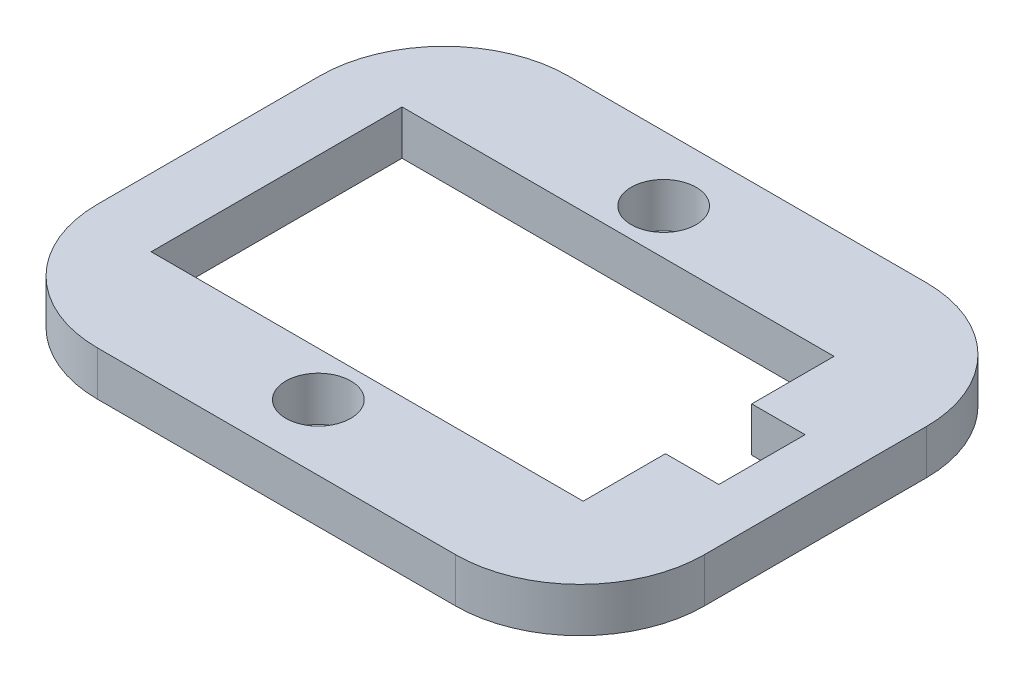
ISO-10303-21;
HEADER;
FILE_DESCRIPTION(('STEP AP214'),'2;1');
FILE_NAME('part.step','',(''),(''),'','','');
FILE_SCHEMA(('AUTOMOTIVE_DESIGN { 1 0 10303 214 1 1 1 1 }'));
ENDSEC;
DATA;
#1=APPLICATION_CONTEXT('core data for automotive mechanical design processes');
#2=APPLICATION_PROTOCOL_DEFINITION('international standard','automotive_design',2000,#1);
#3=PRODUCT_CONTEXT('',#1,'mechanical');
#4=PRODUCT('Part','Part','',(#3));
#5=PRODUCT_RELATED_PRODUCT_CATEGORY('part','',(#4));
#6=PRODUCT_DEFINITION_FORMATION('','',#4);
#7=PRODUCT_DEFINITION_CONTEXT('part definition',#1,'design');
#8=PRODUCT_DEFINITION('design','',#6,#7);
#9=PRODUCT_DEFINITION_SHAPE('','',#8);
#10=(LENGTH_UNIT() NAMED_UNIT(*) SI_UNIT(.MILLI.,.METRE.));
#11=(NAMED_UNIT(*) PLANE_ANGLE_UNIT() SI_UNIT($,.RADIAN.));
#12=(NAMED_UNIT(*) SI_UNIT($,.STERADIAN.) SOLID_ANGLE_UNIT());
#13=UNCERTAINTY_MEASURE_WITH_UNIT(LENGTH_MEASURE(1.E-05),#10,'distance_accuracy_value','');
#14=(GEOMETRIC_REPRESENTATION_CONTEXT(3) GLOBAL_UNCERTAINTY_ASSIGNED_CONTEXT((#13)) GLOBAL_UNIT_ASSIGNED_CONTEXT((#10,
#11,#12)) REPRESENTATION_CONTEXT('',''));
#15=CARTESIAN_POINT('',(0.,0.,0.));
#16=DIRECTION('',(0.,0.,1.));
#17=DIRECTION('',(1.,0.,0.));
#18=AXIS2_PLACEMENT_3D('',#15,#16,#17);
#19=CARTESIAN_POINT('',(-9.70149163847779,1.25,5.46157378435517));
#20=DIRECTION('',(0.,1.,0.));
#21=DIRECTION('',(0.,0.,1.));
#22=AXIS2_PLACEMENT_3D('',#19,#20,#21);
#23=PLANE('',#22);
#24=CARTESIAN_POINT('',(-0.702610465116271,1.25,-10.3664818651471));
#25=DIRECTION('',(0.,1.,0.));
#26=DIRECTION('',(0.,0.,1.));
#27=AXIS2_PLACEMENT_3D('',#24,#25,#26);
#28=CIRCLE('',#27,1.825);
#29=CARTESIAN_POINT('',(-0.702610465116271,1.25,-8.54148186514709));
#30=VERTEX_POINT('',#29);
#31=EDGE_CURVE('E201',#30,#30,#28,.T.);
#32=ORIENTED_EDGE('',*,*,#31,.F.);
#33=EDGE_LOOP('',(#32));
#34=FACE_BOUND('',#33,.T.);
#35=CARTESIAN_POINT('',(-9.70149163847779,1.25,5.46157378435517));
#36=DIRECTION('',(0.,1.,0.));
#37=DIRECTION('',(0.,0.,1.));
#38=AXIS2_PLACEMENT_3D('',#35,#36,#37);
#39=CIRCLE('',#38,7.);
#40=CARTESIAN_POINT('',(-16.7014916384778,1.25,5.46157378435512));
#41=VERTEX_POINT('',#40);
#42=CARTESIAN_POINT('',(-9.70149163847774,1.25,12.4615737843552));
#43=VERTEX_POINT('',#42);
#44=EDGE_CURVE('E245',#41,#43,#39,.T.);
#45=ORIENTED_EDGE('',*,*,#44,.T.);
#46=DIRECTION('',(1.,0.,0.));
#47=VECTOR('',#46,1.);
#48=CARTESIAN_POINT('',(-9.70149163847774,1.25,12.4615737843552));
#49=LINE('',#48,#47);
#50=CARTESIAN_POINT('',(10.4229383615221,1.25,12.4615737843552));
#51=VERTEX_POINT('',#50);
#52=EDGE_CURVE('E249',#43,#51,#49,.T.);
#53=ORIENTED_EDGE('',*,*,#52,.T.);
#54=CARTESIAN_POINT('',(10.4229383615222,1.25,5.46157378435517));
#55=DIRECTION('',(0.,1.,0.));
#56=DIRECTION('',(0.,0.,1.));
#57=AXIS2_PLACEMENT_3D('',#54,#55,#56);
#58=CIRCLE('',#57,7.);
#59=CARTESIAN_POINT('',(17.4229383615222,1.25,5.46157378435512));
#60=VERTEX_POINT('',#59);
#61=EDGE_CURVE('E253',#51,#60,#58,.T.);
#62=ORIENTED_EDGE('',*,*,#61,.T.);
#63=DIRECTION('',(0.,0.,-1.));
#64=VECTOR('',#63,1.);
#65=CARTESIAN_POINT('',(17.4229383615222,1.25,-7.01657898520079));
#66=LINE('',#65,#64);
#67=CARTESIAN_POINT('',(17.4229383615222,1.25,-7.01657898520079));
#68=VERTEX_POINT('',#67);
#69=EDGE_CURVE('E256',#60,#68,#66,.T.);
#70=ORIENTED_EDGE('',*,*,#69,.T.);
#71=CARTESIAN_POINT('',(10.4229383615222,1.25,-7.01657898520084));
#72=DIRECTION('',(0.,1.,0.));
#73=DIRECTION('',(0.,0.,-1.));
#74=AXIS2_PLACEMENT_3D('',#71,#72,#73);
#75=CIRCLE('',#74,7.);
#76=CARTESIAN_POINT('',(10.4229383615221,1.25,-14.0165789852008));
#77=VERTEX_POINT('',#76);
#78=EDGE_CURVE('E259',#68,#77,#75,.T.);
#79=ORIENTED_EDGE('',*,*,#78,.T.);
#80=DIRECTION('',(-1.,0.,0.));
#81=VECTOR('',#80,1.);
#82=CARTESIAN_POINT('',(-9.70149163847775,1.25,-14.0165789852008));
#83=LINE('',#82,#81);
#84=CARTESIAN_POINT('',(-9.70149163847775,1.25,-14.0165789852008));
#85=VERTEX_POINT('',#84);
#86=EDGE_CURVE('E262',#77,#85,#83,.T.);
#87=ORIENTED_EDGE('',*,*,#86,.T.);
#88=CARTESIAN_POINT('',(-9.7014916384778,1.25,-7.01657898520084));
#89=DIRECTION('',(0.,1.,0.));
#90=DIRECTION('',(0.,0.,1.));
#91=AXIS2_PLACEMENT_3D('',#88,#89,#90);
#92=CIRCLE('',#91,7.);
#93=CARTESIAN_POINT('',(-16.7014916384778,1.25,-7.01657898520079));
#94=VERTEX_POINT('',#93);
#95=EDGE_CURVE('E265',#85,#94,#92,.T.);
#96=ORIENTED_EDGE('',*,*,#95,.T.);
#97=DIRECTION('',(0.,0.,1.));
#98=VECTOR('',#97,1.);
#99=CARTESIAN_POINT('',(-16.7014916384778,1.25,-7.01657898520079));
#100=LINE('',#99,#98);
#101=EDGE_CURVE('E268',#94,#41,#100,.T.);
#102=ORIENTED_EDGE('',*,*,#101,.T.);
#103=EDGE_LOOP('',(#45,#53,#62,#70,#79,#87,#96,#102));
#104=FACE_BOUND('',#103,.T.);
#105=DIRECTION('',(1.,0.,0.));
#106=VECTOR('',#105,1.);
#107=CARTESIAN_POINT('',(11.4112391266143,1.25,6.27157377957716));
#108=LINE('',#107,#106);
#109=CARTESIAN_POINT('',(-12.8783508733857,1.25,6.27157377957716));
#110=VERTEX_POINT('',#109);
#111=CARTESIAN_POINT('',(11.4112391266143,1.25,6.27157377957716));
#112=VERTEX_POINT('',#111);
#113=EDGE_CURVE('E162',#110,#112,#108,.T.);
#114=ORIENTED_EDGE('',*,*,#113,.F.);
#115=DIRECTION('',(0.,0.,1.));
#116=VECTOR('',#115,1.);
#117=CARTESIAN_POINT('',(-12.8783508733857,1.25,6.27157377957716));
#118=LINE('',#117,#116);
#119=CARTESIAN_POINT('',(-12.8783508733857,1.25,-7.83354898042284));
#120=VERTEX_POINT('',#119);
#121=EDGE_CURVE('E153',#120,#110,#118,.T.);
#122=ORIENTED_EDGE('',*,*,#121,.F.);
#123=DIRECTION('',(-1.,0.,0.));
#124=VECTOR('',#123,1.);
#125=CARTESIAN_POINT('',(-12.8783508733857,1.25,-7.83354898042284));
#126=LINE('',#125,#124);
#127=CARTESIAN_POINT('',(11.4112391266143,1.25,-7.83354898042284));
#128=VERTEX_POINT('',#127);
#129=EDGE_CURVE('E196',#128,#120,#126,.T.);
#130=ORIENTED_EDGE('',*,*,#129,.F.);
#131=DIRECTION('',(0.,0.,-1.));
#132=VECTOR('',#131,1.);
#133=CARTESIAN_POINT('',(11.4112391266143,1.25,-7.83354898042284));
#134=LINE('',#133,#132);
#135=CARTESIAN_POINT('',(11.4112391266143,1.25,-3.20588260042284));
#136=VERTEX_POINT('',#135);
#137=EDGE_CURVE('E193',#136,#128,#134,.T.);
#138=ORIENTED_EDGE('',*,*,#137,.F.);
#139=DIRECTION('',(-1.,0.,0.));
#140=VECTOR('',#139,1.);
#141=CARTESIAN_POINT('',(11.4112391266143,1.25,-3.20588260042284));
#142=LINE('',#141,#140);
#143=CARTESIAN_POINT('',(14.4112391266143,1.25,-3.20588260042284));
#144=VERTEX_POINT('',#143);
#145=EDGE_CURVE('E190',#144,#136,#142,.T.);
#146=ORIENTED_EDGE('',*,*,#145,.F.);
#147=DIRECTION('',(0.,0.,-1.));
#148=VECTOR('',#147,1.);
#149=CARTESIAN_POINT('',(14.4112391266143,1.25,-3.20588260042284));
#150=LINE('',#149,#148);
#151=CARTESIAN_POINT('',(14.4112391266143,1.25,1.64390739957716));
#152=VERTEX_POINT('',#151);
#153=EDGE_CURVE('E187',#152,#144,#150,.T.);
#154=ORIENTED_EDGE('',*,*,#153,.F.);
#155=DIRECTION('',(1.,0.,0.));
#156=VECTOR('',#155,1.);
#157=CARTESIAN_POINT('',(14.4112391266143,1.25,1.64390739957716));
#158=LINE('',#157,#156);
#159=CARTESIAN_POINT('',(11.4112391266143,1.25,1.64390739957716));
#160=VERTEX_POINT('',#159);
#161=EDGE_CURVE('E181',#160,#152,#158,.T.);
#162=ORIENTED_EDGE('',*,*,#161,.F.);
#163=DIRECTION('',(0.,0.,-1.));
#164=VECTOR('',#163,1.);
#165=CARTESIAN_POINT('',(11.4112391266143,1.25,1.64390739957716));
#166=LINE('',#165,#164);
#167=EDGE_CURVE('E177',#112,#160,#166,.T.);
#168=ORIENTED_EDGE('',*,*,#167,.F.);
#169=EDGE_LOOP('',(#114,#122,#130,#138,#146,#154,#162,#168));
#170=FACE_BOUND('',#169,.T.);
#171=CARTESIAN_POINT('',(-0.978049999999997,1.25,8.77351813485291));
#172=DIRECTION('',(0.,1.,0.));
#173=DIRECTION('',(0.,0.,1.));
#174=AXIS2_PLACEMENT_3D('',#171,#172,#173);
#175=CIRCLE('',#174,1.825);
#176=CARTESIAN_POINT('',(-0.978049999999997,1.25,10.5985181348529));
#177=VERTEX_POINT('',#176);
#178=EDGE_CURVE('E424',#177,#177,#175,.T.);
#179=ORIENTED_EDGE('',*,*,#178,.F.);
#180=EDGE_LOOP('',(#179));
#181=FACE_BOUND('',#180,.T.);
#182=ADVANCED_FACE('F39',(#34,#104,#170,#181),#23,.T.);
#183=CARTESIAN_POINT('',(-9.70149163847779,-1.25,5.46157378435517));
#184=DIRECTION('',(0.,1.,0.));
#185=DIRECTION('',(0.,0.,1.));
#186=AXIS2_PLACEMENT_3D('',#183,#184,#185);
#187=PLANE('',#186);
#188=CARTESIAN_POINT('',(-9.70149163847779,-1.25,5.46157378435517));
#189=DIRECTION('',(0.,1.,0.));
#190=DIRECTION('',(0.,0.,1.));
#191=AXIS2_PLACEMENT_3D('',#188,#189,#190);
#192=CIRCLE('',#191,7.);
#193=CARTESIAN_POINT('',(-16.7014916384778,-1.25,5.46157378435512));
#194=VERTEX_POINT('',#193);
#195=CARTESIAN_POINT('',(-9.70149163847774,-1.25,12.4615737843552));
#196=VERTEX_POINT('',#195);
#197=EDGE_CURVE('E171',#194,#196,#192,.T.);
#198=ORIENTED_EDGE('',*,*,#197,.F.);
#199=DIRECTION('',(0.,0.,1.));
#200=VECTOR('',#199,1.);
#201=CARTESIAN_POINT('',(-16.7014916384778,-1.25,-7.01657898520079));
#202=LINE('',#201,#200);
#203=CARTESIAN_POINT('',(-16.7014916384778,-1.25,-7.01657898520079));
#204=VERTEX_POINT('',#203);
#205=EDGE_CURVE('E250',#204,#194,#202,.T.);
#206=ORIENTED_EDGE('',*,*,#205,.F.);
#207=CARTESIAN_POINT('',(-9.7014916384778,-1.25,-7.01657898520084));
#208=DIRECTION('',(0.,1.,0.));
#209=DIRECTION('',(0.,0.,1.));
#210=AXIS2_PLACEMENT_3D('',#207,#208,#209);
#211=CIRCLE('',#210,7.);
#212=CARTESIAN_POINT('',(-9.70149163847775,-1.25,-14.0165789852008));
#213=VERTEX_POINT('',#212);
#214=EDGE_CURVE('E290',#213,#204,#211,.T.);
#215=ORIENTED_EDGE('',*,*,#214,.F.);
#216=DIRECTION('',(-1.,0.,0.));
#217=VECTOR('',#216,1.);
#218=CARTESIAN_POINT('',(-9.70149163847775,-1.25,-14.0165789852008));
#219=LINE('',#218,#217);
#220=CARTESIAN_POINT('',(10.4229383615221,-1.25,-14.0165789852008));
#221=VERTEX_POINT('',#220);
#222=EDGE_CURVE('E287',#221,#213,#219,.T.);
#223=ORIENTED_EDGE('',*,*,#222,.F.);
#224=CARTESIAN_POINT('',(10.4229383615222,-1.25,-7.01657898520084));
#225=DIRECTION('',(0.,1.,0.));
#226=DIRECTION('',(0.,0.,-1.));
#227=AXIS2_PLACEMENT_3D('',#224,#225,#226);
#228=CIRCLE('',#227,7.);
#229=CARTESIAN_POINT('',(17.4229383615222,-1.25,-7.01657898520079));
#230=VERTEX_POINT('',#229);
#231=EDGE_CURVE('E284',#230,#221,#228,.T.);
#232=ORIENTED_EDGE('',*,*,#231,.F.);
#233=DIRECTION('',(0.,0.,-1.));
#234=VECTOR('',#233,1.);
#235=CARTESIAN_POINT('',(17.4229383615222,-1.25,-7.01657898520079));
#236=LINE('',#235,#234);
#237=CARTESIAN_POINT('',(17.4229383615222,-1.25,5.46157378435512));
#238=VERTEX_POINT('',#237);
#239=EDGE_CURVE('E281',#238,#230,#236,.T.);
#240=ORIENTED_EDGE('',*,*,#239,.F.);
#241=CARTESIAN_POINT('',(10.4229383615222,-1.25,5.46157378435517));
#242=DIRECTION('',(0.,1.,0.));
#243=DIRECTION('',(0.,0.,1.));
#244=AXIS2_PLACEMENT_3D('',#241,#242,#243);
#245=CIRCLE('',#244,7.);
#246=CARTESIAN_POINT('',(10.4229383615221,-1.25,12.4615737843552));
#247=VERTEX_POINT('',#246);
#248=EDGE_CURVE('E278',#247,#238,#245,.T.);
#249=ORIENTED_EDGE('',*,*,#248,.F.);
#250=DIRECTION('',(1.,0.,0.));
#251=VECTOR('',#250,1.);
#252=CARTESIAN_POINT('',(-9.70149163847774,-1.25,12.4615737843552));
#253=LINE('',#252,#251);
#254=EDGE_CURVE('E275',#196,#247,#253,.T.);
#255=ORIENTED_EDGE('',*,*,#254,.F.);
#256=EDGE_LOOP('',(#198,#206,#215,#223,#232,#240,#249,#255));
#257=FACE_BOUND('',#256,.T.);
#258=DIRECTION('',(0.,0.,1.));
#259=VECTOR('',#258,1.);
#260=CARTESIAN_POINT('',(-12.8783508733857,-1.25,6.27157377957716));
#261=LINE('',#260,#259);
#262=CARTESIAN_POINT('',(-12.8783508733857,-1.25,-7.83354898042284));
#263=VERTEX_POINT('',#262);
#264=CARTESIAN_POINT('',(-12.8783508733857,-1.25,6.27157377957716));
#265=VERTEX_POINT('',#264);
#266=EDGE_CURVE('E63',#263,#265,#261,.T.);
#267=ORIENTED_EDGE('',*,*,#266,.T.);
#268=DIRECTION('',(1.,0.,0.));
#269=VECTOR('',#268,1.);
#270=CARTESIAN_POINT('',(11.4112391266143,-1.25,6.27157377957716));
#271=LINE('',#270,#269);
#272=CARTESIAN_POINT('',(11.4112391266143,-1.25,6.27157377957716));
#273=VERTEX_POINT('',#272);
#274=EDGE_CURVE('E169',#265,#273,#271,.T.);
#275=ORIENTED_EDGE('',*,*,#274,.T.);
#276=DIRECTION('',(0.,0.,-1.));
#277=VECTOR('',#276,1.);
#278=CARTESIAN_POINT('',(11.4112391266143,-1.25,1.64390739957716));
#279=LINE('',#278,#277);
#280=CARTESIAN_POINT('',(11.4112391266143,-1.25,1.64390739957716));
#281=VERTEX_POINT('',#280);
#282=EDGE_CURVE('E204',#273,#281,#279,.T.);
#283=ORIENTED_EDGE('',*,*,#282,.T.);
#284=DIRECTION('',(1.,0.,0.));
#285=VECTOR('',#284,1.);
#286=CARTESIAN_POINT('',(14.4112391266143,-1.25,1.64390739957716));
#287=LINE('',#286,#285);
#288=CARTESIAN_POINT('',(14.4112391266143,-1.25,1.64390739957716));
#289=VERTEX_POINT('',#288);
#290=EDGE_CURVE('E208',#281,#289,#287,.T.);
#291=ORIENTED_EDGE('',*,*,#290,.T.);
#292=DIRECTION('',(0.,0.,-1.));
#293=VECTOR('',#292,1.);
#294=CARTESIAN_POINT('',(14.4112391266143,-1.25,-3.20588260042284));
#295=LINE('',#294,#293);
#296=CARTESIAN_POINT('',(14.4112391266143,-1.25,-3.20588260042284));
#297=VERTEX_POINT('',#296);
#298=EDGE_CURVE('E212',#289,#297,#295,.T.);
#299=ORIENTED_EDGE('',*,*,#298,.T.);
#300=DIRECTION('',(-1.,0.,0.));
#301=VECTOR('',#300,1.);
#302=CARTESIAN_POINT('',(11.4112391266143,-1.25,-3.20588260042284));
#303=LINE('',#302,#301);
#304=CARTESIAN_POINT('',(11.4112391266143,-1.25,-3.20588260042284));
#305=VERTEX_POINT('',#304);
#306=EDGE_CURVE('E216',#297,#305,#303,.T.);
#307=ORIENTED_EDGE('',*,*,#306,.T.);
#308=DIRECTION('',(0.,0.,-1.));
#309=VECTOR('',#308,1.);
#310=CARTESIAN_POINT('',(11.4112391266143,-1.25,-7.83354898042284));
#311=LINE('',#310,#309);
#312=CARTESIAN_POINT('',(11.4112391266143,-1.25,-7.83354898042284));
#313=VERTEX_POINT('',#312);
#314=EDGE_CURVE('E220',#305,#313,#311,.T.);
#315=ORIENTED_EDGE('',*,*,#314,.T.);
#316=DIRECTION('',(-1.,0.,0.));
#317=VECTOR('',#316,1.);
#318=CARTESIAN_POINT('',(-12.8783508733857,-1.25,-7.83354898042284));
#319=LINE('',#318,#317);
#320=EDGE_CURVE('E163',#313,#263,#319,.T.);
#321=ORIENTED_EDGE('',*,*,#320,.T.);
#322=EDGE_LOOP('',(#267,#275,#283,#291,#299,#307,#315,#321));
#323=FACE_BOUND('',#322,.T.);
#324=CARTESIAN_POINT('',(-0.702610465116271,-1.25,-10.3664818651471));
#325=DIRECTION('',(0.,1.,0.));
#326=DIRECTION('',(0.,0.,1.));
#327=AXIS2_PLACEMENT_3D('',#324,#325,#326);
#328=CIRCLE('',#327,1.825);
#329=CARTESIAN_POINT('',(-0.702610465116271,-1.25,-8.54148186514709));
#330=VERTEX_POINT('',#329);
#331=EDGE_CURVE('E432',#330,#330,#328,.T.);
#332=ORIENTED_EDGE('',*,*,#331,.T.);
#333=EDGE_LOOP('',(#332));
#334=FACE_BOUND('',#333,.T.);
#335=CARTESIAN_POINT('',(-0.978049999999997,-1.25,8.77351813485291));
#336=DIRECTION('',(0.,1.,0.));
#337=DIRECTION('',(0.,0.,1.));
#338=AXIS2_PLACEMENT_3D('',#335,#336,#337);
#339=CIRCLE('',#338,1.825);
#340=CARTESIAN_POINT('',(-0.978049999999997,-1.25,10.5985181348529));
#341=VERTEX_POINT('',#340);
#342=EDGE_CURVE('E427',#341,#341,#339,.T.);
#343=ORIENTED_EDGE('',*,*,#342,.T.);
#344=EDGE_LOOP('',(#343));
#345=FACE_BOUND('',#344,.T.);
#346=ADVANCED_FACE('F329',(#257,#323,#334,#345),#187,.F.);
#347=CARTESIAN_POINT('',(-9.70149163847779,1.25,5.46157378435517));
#348=DIRECTION('',(0.,-1.,0.));
#349=DIRECTION('',(0.,0.,-1.));
#350=AXIS2_PLACEMENT_3D('',#347,#348,#349);
#351=CYLINDRICAL_SURFACE('',#350,7.);
#352=ORIENTED_EDGE('',*,*,#197,.T.);
#353=DIRECTION('',(0.,-1.,0.));
#354=VECTOR('',#353,1.);
#355=CARTESIAN_POINT('',(-9.70149163847774,1.25,12.4615737843552));
#356=LINE('',#355,#354);
#357=EDGE_CURVE('E11',#43,#196,#356,.T.);
#358=ORIENTED_EDGE('',*,*,#357,.F.);
#359=ORIENTED_EDGE('',*,*,#44,.F.);
#360=DIRECTION('',(0.,-1.,0.));
#361=VECTOR('',#360,1.);
#362=CARTESIAN_POINT('',(-16.7014916384778,1.25,5.46157378435512));
#363=LINE('',#362,#361);
#364=EDGE_CURVE('E271',#41,#194,#363,.T.);
#365=ORIENTED_EDGE('',*,*,#364,.T.);
#366=EDGE_LOOP('',(#352,#358,#359,#365));
#367=FACE_BOUND('',#366,.T.);
#368=ADVANCED_FACE('F41',(#367),#351,.T.);
#369=CARTESIAN_POINT('',(-9.70149163847774,1.25,12.4615737843552));
#370=DIRECTION('',(0.,0.,-1.));
#371=DIRECTION('',(-1.,0.,0.));
#372=AXIS2_PLACEMENT_3D('',#369,#370,#371);
#373=PLANE('',#372);
#374=ORIENTED_EDGE('',*,*,#254,.T.);
#375=DIRECTION('',(0.,-1.,0.));
#376=VECTOR('',#375,1.);
#377=CARTESIAN_POINT('',(10.4229383615221,1.25,12.4615737843552));
#378=LINE('',#377,#376);
#379=EDGE_CURVE('E48',#51,#247,#378,.T.);
#380=ORIENTED_EDGE('',*,*,#379,.F.);
#381=ORIENTED_EDGE('',*,*,#52,.F.);
#382=ORIENTED_EDGE('',*,*,#357,.T.);
#383=EDGE_LOOP('',(#374,#380,#381,#382));
#384=FACE_BOUND('',#383,.T.);
#385=ADVANCED_FACE('F346',(#384),#373,.F.);
#386=CARTESIAN_POINT('',(10.4229383615222,1.25,5.46157378435517));
#387=DIRECTION('',(0.,-1.,0.));
#388=DIRECTION('',(0.,0.,-1.));
#389=AXIS2_PLACEMENT_3D('',#386,#387,#388);
#390=CYLINDRICAL_SURFACE('',#389,7.);
#391=ORIENTED_EDGE('',*,*,#248,.T.);
#392=DIRECTION('',(0.,-1.,0.));
#393=VECTOR('',#392,1.);
#394=CARTESIAN_POINT('',(17.4229383615222,1.25,5.46157378435512));
#395=LINE('',#394,#393);
#396=EDGE_CURVE('E314',#60,#238,#395,.T.);
#397=ORIENTED_EDGE('',*,*,#396,.F.);
#398=ORIENTED_EDGE('',*,*,#61,.F.);
#399=ORIENTED_EDGE('',*,*,#379,.T.);
#400=EDGE_LOOP('',(#391,#397,#398,#399));
#401=FACE_BOUND('',#400,.T.);
#402=ADVANCED_FACE('F323',(#401),#390,.T.);
#403=CARTESIAN_POINT('',(17.4229383615222,1.25,-7.01657898520079));
#404=DIRECTION('',(-1.,0.,0.));
#405=DIRECTION('',(0.,0.,1.));
#406=AXIS2_PLACEMENT_3D('',#403,#404,#405);
#407=PLANE('',#406);
#408=ORIENTED_EDGE('',*,*,#239,.T.);
#409=DIRECTION('',(0.,-1.,0.));
#410=VECTOR('',#409,1.);
#411=CARTESIAN_POINT('',(17.4229383615222,1.25,-7.01657898520079));
#412=LINE('',#411,#410);
#413=EDGE_CURVE('E310',#68,#230,#412,.T.);
#414=ORIENTED_EDGE('',*,*,#413,.F.);
#415=ORIENTED_EDGE('',*,*,#69,.F.);
#416=ORIENTED_EDGE('',*,*,#396,.T.);
#417=EDGE_LOOP('',(#408,#414,#415,#416));
#418=FACE_BOUND('',#417,.T.);
#419=ADVANCED_FACE('F335',(#418),#407,.F.);
#420=CARTESIAN_POINT('',(10.4229383615222,1.25,-7.01657898520084));
#421=DIRECTION('',(0.,-1.,0.));
#422=DIRECTION('',(0.,0.,-1.));
#423=AXIS2_PLACEMENT_3D('',#420,#421,#422);
#424=CYLINDRICAL_SURFACE('',#423,7.);
#425=ORIENTED_EDGE('',*,*,#231,.T.);
#426=DIRECTION('',(0.,-1.,0.));
#427=VECTOR('',#426,1.);
#428=CARTESIAN_POINT('',(10.4229383615221,1.25,-14.0165789852008));
#429=LINE('',#428,#427);
#430=EDGE_CURVE('E306',#77,#221,#429,.T.);
#431=ORIENTED_EDGE('',*,*,#430,.F.);
#432=ORIENTED_EDGE('',*,*,#78,.F.);
#433=ORIENTED_EDGE('',*,*,#413,.T.);
#434=EDGE_LOOP('',(#425,#431,#432,#433));
#435=FACE_BOUND('',#434,.T.);
#436=ADVANCED_FACE('F339',(#435),#424,.T.);
#437=CARTESIAN_POINT('',(-9.70149163847775,1.25,-14.0165789852008));
#438=DIRECTION('',(0.,0.,1.));
#439=DIRECTION('',(1.,0.,0.));
#440=AXIS2_PLACEMENT_3D('',#437,#438,#439);
#441=PLANE('',#440);
#442=ORIENTED_EDGE('',*,*,#222,.T.);
#443=DIRECTION('',(0.,-1.,0.));
#444=VECTOR('',#443,1.);
#445=CARTESIAN_POINT('',(-9.70149163847775,1.25,-14.0165789852008));
#446=LINE('',#445,#444);
#447=EDGE_CURVE('E302',#85,#213,#446,.T.);
#448=ORIENTED_EDGE('',*,*,#447,.F.);
#449=ORIENTED_EDGE('',*,*,#86,.F.);
#450=ORIENTED_EDGE('',*,*,#430,.T.);
#451=EDGE_LOOP('',(#442,#448,#449,#450));
#452=FACE_BOUND('',#451,.T.);
#453=ADVANCED_FACE('F359',(#452),#441,.F.);
#454=CARTESIAN_POINT('',(-9.7014916384778,1.25,-7.01657898520084));
#455=DIRECTION('',(0.,-1.,0.));
#456=DIRECTION('',(0.,0.,-1.));
#457=AXIS2_PLACEMENT_3D('',#454,#455,#456);
#458=CYLINDRICAL_SURFACE('',#457,7.);
#459=ORIENTED_EDGE('',*,*,#214,.T.);
#460=DIRECTION('',(0.,-1.,0.));
#461=VECTOR('',#460,1.);
#462=CARTESIAN_POINT('',(-16.7014916384778,1.25,-7.01657898520079));
#463=LINE('',#462,#461);
#464=EDGE_CURVE('E298',#94,#204,#463,.T.);
#465=ORIENTED_EDGE('',*,*,#464,.F.);
#466=ORIENTED_EDGE('',*,*,#95,.F.);
#467=ORIENTED_EDGE('',*,*,#447,.T.);
#468=EDGE_LOOP('',(#459,#465,#466,#467));
#469=FACE_BOUND('',#468,.T.);
#470=ADVANCED_FACE('F357',(#469),#458,.T.);
#471=CARTESIAN_POINT('',(-16.7014916384778,1.25,-7.01657898520079));
#472=DIRECTION('',(1.,0.,0.));
#473=DIRECTION('',(0.,0.,-1.));
#474=AXIS2_PLACEMENT_3D('',#471,#472,#473);
#475=PLANE('',#474);
#476=ORIENTED_EDGE('',*,*,#205,.T.);
#477=ORIENTED_EDGE('',*,*,#364,.F.);
#478=ORIENTED_EDGE('',*,*,#101,.F.);
#479=ORIENTED_EDGE('',*,*,#464,.T.);
#480=EDGE_LOOP('',(#476,#477,#478,#479));
#481=FACE_BOUND('',#480,.T.);
#482=ADVANCED_FACE('F352',(#481),#475,.F.);
#483=CARTESIAN_POINT('',(-12.8783508733857,1.25,6.27157377957716));
#484=DIRECTION('',(1.,0.,0.));
#485=DIRECTION('',(0.,0.,-1.));
#486=AXIS2_PLACEMENT_3D('',#483,#484,#485);
#487=PLANE('',#486);
#488=ORIENTED_EDGE('',*,*,#266,.F.);
#489=DIRECTION('',(0.,-1.,0.));
#490=VECTOR('',#489,1.);
#491=CARTESIAN_POINT('',(-12.8783508733857,1.25,-7.83354898042284));
#492=LINE('',#491,#490);
#493=EDGE_CURVE('E157',#120,#263,#492,.T.);
#494=ORIENTED_EDGE('',*,*,#493,.F.);
#495=ORIENTED_EDGE('',*,*,#121,.T.);
#496=DIRECTION('',(0.,-1.,0.));
#497=VECTOR('',#496,1.);
#498=CARTESIAN_POINT('',(-12.8783508733857,1.25,6.27157377957716));
#499=LINE('',#498,#497);
#500=EDGE_CURVE('E156',#110,#265,#499,.T.);
#501=ORIENTED_EDGE('',*,*,#500,.T.);
#502=EDGE_LOOP('',(#488,#494,#495,#501));
#503=FACE_BOUND('',#502,.T.);
#504=ADVANCED_FACE('F155',(#503),#487,.T.);
#505=CARTESIAN_POINT('',(11.4112391266143,1.25,6.27157377957716));
#506=DIRECTION('',(0.,0.,-1.));
#507=DIRECTION('',(-1.,0.,0.));
#508=AXIS2_PLACEMENT_3D('',#505,#506,#507);
#509=PLANE('',#508);
#510=ORIENTED_EDGE('',*,*,#274,.F.);
#511=ORIENTED_EDGE('',*,*,#500,.F.);
#512=ORIENTED_EDGE('',*,*,#113,.T.);
#513=DIRECTION('',(0.,-1.,0.));
#514=VECTOR('',#513,1.);
#515=CARTESIAN_POINT('',(11.4112391266143,1.25,6.27157377957716));
#516=LINE('',#515,#514);
#517=EDGE_CURVE('E172',#112,#273,#516,.T.);
#518=ORIENTED_EDGE('',*,*,#517,.T.);
#519=EDGE_LOOP('',(#510,#511,#512,#518));
#520=FACE_BOUND('',#519,.T.);
#521=ADVANCED_FACE('F166',(#520),#509,.T.);
#522=CARTESIAN_POINT('',(11.4112391266143,1.25,1.64390739957716));
#523=DIRECTION('',(-1.,0.,0.));
#524=DIRECTION('',(0.,0.,1.));
#525=AXIS2_PLACEMENT_3D('',#522,#523,#524);
#526=PLANE('',#525);
#527=ORIENTED_EDGE('',*,*,#282,.F.);
#528=ORIENTED_EDGE('',*,*,#517,.F.);
#529=ORIENTED_EDGE('',*,*,#167,.T.);
#530=DIRECTION('',(0.,-1.,0.));
#531=VECTOR('',#530,1.);
#532=CARTESIAN_POINT('',(11.4112391266143,1.25,1.64390739957716));
#533=LINE('',#532,#531);
#534=EDGE_CURVE('E240',#160,#281,#533,.T.);
#535=ORIENTED_EDGE('',*,*,#534,.T.);
#536=EDGE_LOOP('',(#527,#528,#529,#535));
#537=FACE_BOUND('',#536,.T.);
#538=ADVANCED_FACE('F386',(#537),#526,.T.);
#539=CARTESIAN_POINT('',(14.4112391266143,1.25,1.64390739957716));
#540=DIRECTION('',(0.,0.,-1.));
#541=DIRECTION('',(-1.,0.,0.));
#542=AXIS2_PLACEMENT_3D('',#539,#540,#541);
#543=PLANE('',#542);
#544=ORIENTED_EDGE('',*,*,#290,.F.);
#545=ORIENTED_EDGE('',*,*,#534,.F.);
#546=ORIENTED_EDGE('',*,*,#161,.T.);
#547=DIRECTION('',(0.,-1.,0.));
#548=VECTOR('',#547,1.);
#549=CARTESIAN_POINT('',(14.4112391266143,1.25,1.64390739957716));
#550=LINE('',#549,#548);
#551=EDGE_CURVE('E237',#152,#289,#550,.T.);
#552=ORIENTED_EDGE('',*,*,#551,.T.);
#553=EDGE_LOOP('',(#544,#545,#546,#552));
#554=FACE_BOUND('',#553,.T.);
#555=ADVANCED_FACE('F390',(#554),#543,.T.);
#556=CARTESIAN_POINT('',(14.4112391266143,1.25,-3.20588260042284));
#557=DIRECTION('',(-1.,0.,0.));
#558=DIRECTION('',(0.,0.,1.));
#559=AXIS2_PLACEMENT_3D('',#556,#557,#558);
#560=PLANE('',#559);
#561=ORIENTED_EDGE('',*,*,#298,.F.);
#562=ORIENTED_EDGE('',*,*,#551,.F.);
#563=ORIENTED_EDGE('',*,*,#153,.T.);
#564=DIRECTION('',(0.,-1.,0.));
#565=VECTOR('',#564,1.);
#566=CARTESIAN_POINT('',(14.4112391266143,1.25,-3.20588260042284));
#567=LINE('',#566,#565);
#568=EDGE_CURVE('E234',#144,#297,#567,.T.);
#569=ORIENTED_EDGE('',*,*,#568,.T.);
#570=EDGE_LOOP('',(#561,#562,#563,#569));
#571=FACE_BOUND('',#570,.T.);
#572=ADVANCED_FACE('F396',(#571),#560,.T.);
#573=CARTESIAN_POINT('',(11.4112391266143,1.25,-3.20588260042284));
#574=DIRECTION('',(0.,0.,1.));
#575=DIRECTION('',(1.,0.,0.));
#576=AXIS2_PLACEMENT_3D('',#573,#574,#575);
#577=PLANE('',#576);
#578=ORIENTED_EDGE('',*,*,#306,.F.);
#579=ORIENTED_EDGE('',*,*,#568,.F.);
#580=ORIENTED_EDGE('',*,*,#145,.T.);
#581=DIRECTION('',(0.,-1.,0.));
#582=VECTOR('',#581,1.);
#583=CARTESIAN_POINT('',(11.4112391266143,1.25,-3.20588260042284));
#584=LINE('',#583,#582);
#585=EDGE_CURVE('E231',#136,#305,#584,.T.);
#586=ORIENTED_EDGE('',*,*,#585,.T.);
#587=EDGE_LOOP('',(#578,#579,#580,#586));
#588=FACE_BOUND('',#587,.T.);
#589=ADVANCED_FACE('F400',(#588),#577,.T.);
#590=CARTESIAN_POINT('',(11.4112391266143,1.25,-7.83354898042284));
#591=DIRECTION('',(-1.,0.,0.));
#592=DIRECTION('',(0.,0.,1.));
#593=AXIS2_PLACEMENT_3D('',#590,#591,#592);
#594=PLANE('',#593);
#595=ORIENTED_EDGE('',*,*,#314,.F.);
#596=ORIENTED_EDGE('',*,*,#585,.F.);
#597=ORIENTED_EDGE('',*,*,#137,.T.);
#598=DIRECTION('',(0.,-1.,0.));
#599=VECTOR('',#598,1.);
#600=CARTESIAN_POINT('',(11.4112391266143,1.25,-7.83354898042284));
#601=LINE('',#600,#599);
#602=EDGE_CURVE('E55',#128,#313,#601,.T.);
#603=ORIENTED_EDGE('',*,*,#602,.T.);
#604=EDGE_LOOP('',(#595,#596,#597,#603));
#605=FACE_BOUND('',#604,.T.);
#606=ADVANCED_FACE('F404',(#605),#594,.T.);
#607=CARTESIAN_POINT('',(-12.8783508733857,1.25,-7.83354898042284));
#608=DIRECTION('',(0.,0.,1.));
#609=DIRECTION('',(1.,0.,0.));
#610=AXIS2_PLACEMENT_3D('',#607,#608,#609);
#611=PLANE('',#610);
#612=ORIENTED_EDGE('',*,*,#320,.F.);
#613=ORIENTED_EDGE('',*,*,#602,.F.);
#614=ORIENTED_EDGE('',*,*,#129,.T.);
#615=ORIENTED_EDGE('',*,*,#493,.T.);
#616=EDGE_LOOP('',(#612,#613,#614,#615));
#617=FACE_BOUND('',#616,.T.);
#618=ADVANCED_FACE('F408',(#617),#611,.T.);
#619=CARTESIAN_POINT('',(-0.702610465116271,1.25,-10.3664818651471));
#620=DIRECTION('',(0.,-1.,0.));
#621=DIRECTION('',(0.,0.,-1.));
#622=AXIS2_PLACEMENT_3D('',#619,#620,#621);
#623=CYLINDRICAL_SURFACE('',#622,1.825);
#624=ORIENTED_EDGE('',*,*,#31,.T.);
#625=EDGE_LOOP('',(#624));
#626=FACE_BOUND('',#625,.T.);
#627=ORIENTED_EDGE('',*,*,#331,.F.);
#628=EDGE_LOOP('',(#627));
#629=FACE_BOUND('',#628,.T.);
#630=ADVANCED_FACE('F412',(#626,#629),#623,.F.);
#631=CARTESIAN_POINT('',(-0.978049999999997,1.25,8.77351813485291));
#632=DIRECTION('',(0.,-1.,0.));
#633=DIRECTION('',(0.,0.,-1.));
#634=AXIS2_PLACEMENT_3D('',#631,#632,#633);
#635=CYLINDRICAL_SURFACE('',#634,1.825);
#636=ORIENTED_EDGE('',*,*,#178,.T.);
#637=EDGE_LOOP('',(#636));
#638=FACE_BOUND('',#637,.T.);
#639=ORIENTED_EDGE('',*,*,#342,.F.);
#640=EDGE_LOOP('',(#639));
#641=FACE_BOUND('',#640,.T.);
#642=ADVANCED_FACE('F415',(#638,#641),#635,.F.);
#643=CLOSED_SHELL('',(#182,#346,#368,#385,#402,#419,#436,#453,#470,#482,#504,#521,#538,#555,
#572,#589,#606,#618,#630,#642));
#644=MANIFOLD_SOLID_BREP('B2',#643);
#645=ADVANCED_BREP_SHAPE_REPRESENTATION('',(#18,#644),#14);
#646=SHAPE_DEFINITION_REPRESENTATION(#9,#645);
ENDSEC;
END-ISO-10303-21;
